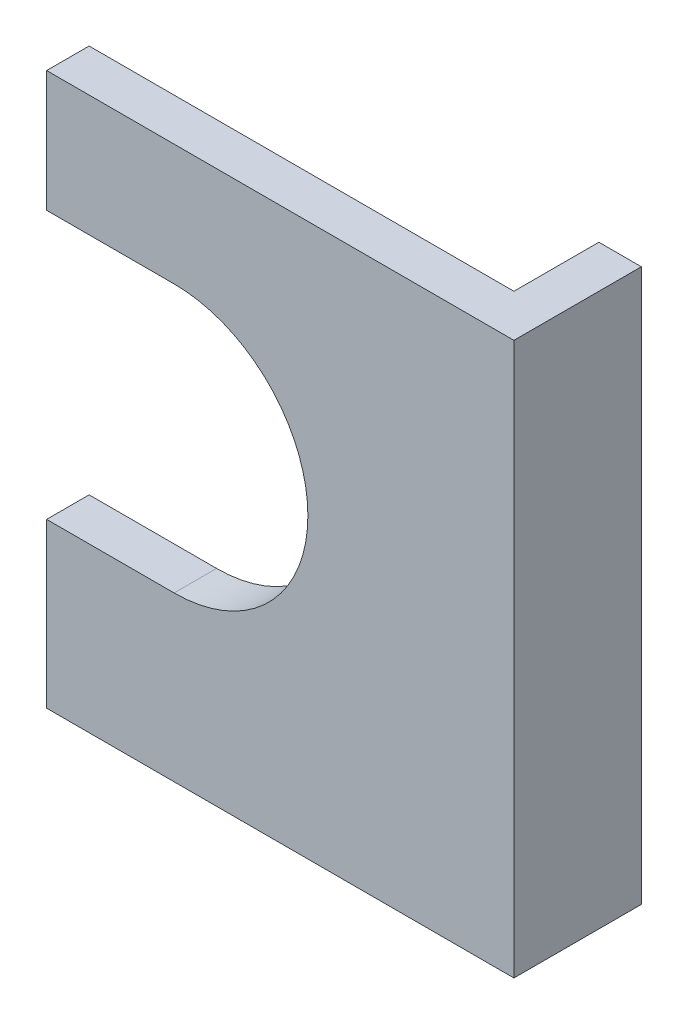
ISO-10303-21;
HEADER;
FILE_DESCRIPTION(('STEP AP214'),'2;1');
FILE_NAME('part.step','',(''),(''),'','','');
FILE_SCHEMA(('AUTOMOTIVE_DESIGN { 1 0 10303 214 1 1 1 1 }'));
ENDSEC;
DATA;
#1=APPLICATION_CONTEXT('core data for automotive mechanical design processes');
#2=APPLICATION_PROTOCOL_DEFINITION('international standard','automotive_design',2000,#1);
#3=PRODUCT_CONTEXT('',#1,'mechanical');
#4=PRODUCT('Part','Part','',(#3));
#5=PRODUCT_RELATED_PRODUCT_CATEGORY('part','',(#4));
#6=PRODUCT_DEFINITION_FORMATION('','',#4);
#7=PRODUCT_DEFINITION_CONTEXT('part definition',#1,'design');
#8=PRODUCT_DEFINITION('design','',#6,#7);
#9=PRODUCT_DEFINITION_SHAPE('','',#8);
#10=(LENGTH_UNIT() NAMED_UNIT(*) SI_UNIT(.MILLI.,.METRE.));
#11=(NAMED_UNIT(*) PLANE_ANGLE_UNIT() SI_UNIT($,.RADIAN.));
#12=(NAMED_UNIT(*) SI_UNIT($,.STERADIAN.) SOLID_ANGLE_UNIT());
#13=UNCERTAINTY_MEASURE_WITH_UNIT(LENGTH_MEASURE(1.E-05),#10,'distance_accuracy_value','');
#14=(GEOMETRIC_REPRESENTATION_CONTEXT(3) GLOBAL_UNCERTAINTY_ASSIGNED_CONTEXT((#13)) GLOBAL_UNIT_ASSIGNED_CONTEXT((#10,
#11,#12)) REPRESENTATION_CONTEXT('',''));
#15=CARTESIAN_POINT('',(0.,0.,0.));
#16=DIRECTION('',(0.,0.,1.));
#17=DIRECTION('',(1.,0.,0.));
#18=AXIS2_PLACEMENT_3D('',#15,#16,#17);
#19=CARTESIAN_POINT('',(60.,90.,-10.));
#20=DIRECTION('',(0.,0.,1.));
#21=DIRECTION('',(0.,-1.,0.));
#22=AXIS2_PLACEMENT_3D('',#19,#20,#21);
#23=PLANE('',#22);
#24=DIRECTION('',(0.,-1.,0.));
#25=VECTOR('',#24,1.);
#26=CARTESIAN_POINT('',(-5.,120.,-10.));
#27=LINE('',#26,#25);
#28=CARTESIAN_POINT('',(-5.,120.,-10.));
#29=VERTEX_POINT('',#28);
#30=CARTESIAN_POINT('',(-5.,91.5,-10.));
#31=VERTEX_POINT('',#30);
#32=EDGE_CURVE('E52',#29,#31,#27,.T.);
#33=ORIENTED_EDGE('',*,*,#32,.F.);
#34=DIRECTION('',(-1.,0.,0.));
#35=VECTOR('',#34,1.);
#36=CARTESIAN_POINT('',(95.,120.,-10.));
#37=LINE('',#36,#35);
#38=CARTESIAN_POINT('',(95.,120.,-10.));
#39=VERTEX_POINT('',#38);
#40=EDGE_CURVE('E182',#39,#29,#37,.T.);
#41=ORIENTED_EDGE('',*,*,#40,.F.);
#42=DIRECTION('',(0.,-1.,0.));
#43=VECTOR('',#42,1.);
#44=CARTESIAN_POINT('',(95.,90.,-10.));
#45=LINE('',#44,#43);
#46=CARTESIAN_POINT('',(95.,0.,-10.));
#47=VERTEX_POINT('',#46);
#48=EDGE_CURVE('E194',#39,#47,#45,.T.);
#49=ORIENTED_EDGE('',*,*,#48,.T.);
#50=DIRECTION('',(-1.,0.,0.));
#51=VECTOR('',#50,1.);
#52=CARTESIAN_POINT('',(60.,0.,-10.));
#53=LINE('',#52,#51);
#54=CARTESIAN_POINT('',(-5.,0.,-10.));
#55=VERTEX_POINT('',#54);
#56=EDGE_CURVE('E202',#47,#55,#53,.T.);
#57=ORIENTED_EDGE('',*,*,#56,.T.);
#58=DIRECTION('',(0.,-1.,0.));
#59=VECTOR('',#58,1.);
#60=CARTESIAN_POINT('',(-5.,28.5,-10.));
#61=LINE('',#60,#59);
#62=CARTESIAN_POINT('',(-5.,28.5,-10.));
#63=VERTEX_POINT('',#62);
#64=EDGE_CURVE('E162',#63,#55,#61,.T.);
#65=ORIENTED_EDGE('',*,*,#64,.F.);
#66=DIRECTION('',(-1.,0.,0.));
#67=VECTOR('',#66,1.);
#68=CARTESIAN_POINT('',(25.,28.5,-10.));
#69=LINE('',#68,#67);
#70=CARTESIAN_POINT('',(25.,28.5,-10.));
#71=VERTEX_POINT('',#70);
#72=EDGE_CURVE('E167',#71,#63,#69,.T.);
#73=ORIENTED_EDGE('',*,*,#72,.F.);
#74=CARTESIAN_POINT('',(25.,60.,-10.));
#75=DIRECTION('',(0.,0.,-1.));
#76=DIRECTION('',(0.,1.,0.));
#77=AXIS2_PLACEMENT_3D('',#74,#75,#76);
#78=CIRCLE('',#77,31.5);
#79=CARTESIAN_POINT('',(25.,91.5,-10.));
#80=VERTEX_POINT('',#79);
#81=EDGE_CURVE('E126',#80,#71,#78,.T.);
#82=ORIENTED_EDGE('',*,*,#81,.F.);
#83=DIRECTION('',(1.,0.,0.));
#84=VECTOR('',#83,1.);
#85=CARTESIAN_POINT('',(25.,91.5,-10.));
#86=LINE('',#85,#84);
#87=EDGE_CURVE('E170',#31,#80,#86,.T.);
#88=ORIENTED_EDGE('',*,*,#87,.F.);
#89=EDGE_LOOP('',(#33,#41,#49,#57,#65,#73,#82,#88));
#90=FACE_BOUND('',#89,.T.);
#91=ADVANCED_FACE('F37',(#90),#23,.F.);
#92=CARTESIAN_POINT('',(60.,-10.,0.));
#93=DIRECTION('',(0.,0.,-1.));
#94=DIRECTION('',(-1.,0.,0.));
#95=AXIS2_PLACEMENT_3D('',#92,#93,#94);
#96=PLANE('',#95);
#97=DIRECTION('',(0.,1.,0.));
#98=VECTOR('',#97,1.);
#99=CARTESIAN_POINT('',(-5.,91.5,0.));
#100=LINE('',#99,#98);
#101=CARTESIAN_POINT('',(-5.,91.5,0.));
#102=VERTEX_POINT('',#101);
#103=CARTESIAN_POINT('',(-5.,120.,0.));
#104=VERTEX_POINT('',#103);
#105=EDGE_CURVE('E155',#102,#104,#100,.T.);
#106=ORIENTED_EDGE('',*,*,#105,.F.);
#107=DIRECTION('',(1.,0.,0.));
#108=VECTOR('',#107,1.);
#109=CARTESIAN_POINT('',(60.,91.5,0.));
#110=LINE('',#109,#108);
#111=CARTESIAN_POINT('',(25.,91.5,0.));
#112=VERTEX_POINT('',#111);
#113=EDGE_CURVE('E180',#102,#112,#110,.T.);
#114=ORIENTED_EDGE('',*,*,#113,.T.);
#115=CARTESIAN_POINT('',(25.,60.,0.));
#116=DIRECTION('',(0.,0.,-1.));
#117=DIRECTION('',(-1.,0.,0.));
#118=AXIS2_PLACEMENT_3D('',#115,#116,#117);
#119=CIRCLE('',#118,31.5);
#120=CARTESIAN_POINT('',(25.,28.5,0.));
#121=VERTEX_POINT('',#120);
#122=EDGE_CURVE('E11',#112,#121,#119,.T.);
#123=ORIENTED_EDGE('',*,*,#122,.T.);
#124=DIRECTION('',(-1.,0.,0.));
#125=VECTOR('',#124,1.);
#126=CARTESIAN_POINT('',(60.,28.5,0.));
#127=LINE('',#126,#125);
#128=CARTESIAN_POINT('',(-5.,28.5,0.));
#129=VERTEX_POINT('',#128);
#130=EDGE_CURVE('E176',#121,#129,#127,.T.);
#131=ORIENTED_EDGE('',*,*,#130,.T.);
#132=DIRECTION('',(0.,1.,0.));
#133=VECTOR('',#132,1.);
#134=CARTESIAN_POINT('',(-5.,-10.,0.));
#135=LINE('',#134,#133);
#136=CARTESIAN_POINT('',(-5.,-10.,0.));
#137=VERTEX_POINT('',#136);
#138=EDGE_CURVE('E60',#137,#129,#135,.T.);
#139=ORIENTED_EDGE('',*,*,#138,.F.);
#140=DIRECTION('',(-1.,0.,0.));
#141=VECTOR('',#140,1.);
#142=CARTESIAN_POINT('',(60.,-10.,0.));
#143=LINE('',#142,#141);
#144=CARTESIAN_POINT('',(105.,-10.,0.));
#145=VERTEX_POINT('',#144);
#146=EDGE_CURVE('E45',#145,#137,#143,.T.);
#147=ORIENTED_EDGE('',*,*,#146,.F.);
#148=DIRECTION('',(0.,-1.,0.));
#149=VECTOR('',#148,1.);
#150=CARTESIAN_POINT('',(105.,0.,0.));
#151=LINE('',#150,#149);
#152=CARTESIAN_POINT('',(105.,120.,0.));
#153=VERTEX_POINT('',#152);
#154=EDGE_CURVE('E199',#153,#145,#151,.T.);
#155=ORIENTED_EDGE('',*,*,#154,.F.);
#156=DIRECTION('',(1.,0.,0.));
#157=VECTOR('',#156,1.);
#158=CARTESIAN_POINT('',(-30.,120.,0.));
#159=LINE('',#158,#157);
#160=EDGE_CURVE('E185',#104,#153,#159,.T.);
#161=ORIENTED_EDGE('',*,*,#160,.F.);
#162=EDGE_LOOP('',(#106,#114,#123,#131,#139,#147,#155,#161));
#163=FACE_BOUND('',#162,.T.);
#164=ADVANCED_FACE('F39',(#163),#96,.F.);
#165=CARTESIAN_POINT('',(0.,120.,0.));
#166=DIRECTION('',(0.,1.,0.));
#167=DIRECTION('',(0.,0.,1.));
#168=AXIS2_PLACEMENT_3D('',#165,#166,#167);
#169=PLANE('',#168);
#170=ORIENTED_EDGE('',*,*,#40,.T.);
#171=DIRECTION('',(0.,0.,-1.));
#172=VECTOR('',#171,1.);
#173=CARTESIAN_POINT('',(-5.,120.,0.));
#174=LINE('',#173,#172);
#175=EDGE_CURVE('E157',#104,#29,#174,.T.);
#176=ORIENTED_EDGE('',*,*,#175,.F.);
#177=ORIENTED_EDGE('',*,*,#160,.T.);
#178=DIRECTION('',(0.,0.,-1.));
#179=VECTOR('',#178,1.);
#180=CARTESIAN_POINT('',(105.,120.,0.));
#181=LINE('',#180,#179);
#182=CARTESIAN_POINT('',(105.,120.,-29.9999999999999));
#183=VERTEX_POINT('',#182);
#184=EDGE_CURVE('E187',#153,#183,#181,.T.);
#185=ORIENTED_EDGE('',*,*,#184,.T.);
#186=DIRECTION('',(1.,0.,0.));
#187=VECTOR('',#186,1.);
#188=CARTESIAN_POINT('',(95.,120.,-29.9999999999999));
#189=LINE('',#188,#187);
#190=CARTESIAN_POINT('',(95.,120.,-29.9999999999999));
#191=VERTEX_POINT('',#190);
#192=EDGE_CURVE('E149',#191,#183,#189,.T.);
#193=ORIENTED_EDGE('',*,*,#192,.F.);
#194=DIRECTION('',(0.,0.,1.));
#195=VECTOR('',#194,1.);
#196=CARTESIAN_POINT('',(95.,120.,-25.));
#197=LINE('',#196,#195);
#198=EDGE_CURVE('E189',#191,#39,#197,.T.);
#199=ORIENTED_EDGE('',*,*,#198,.T.);
#200=EDGE_LOOP('',(#170,#176,#177,#185,#193,#199));
#201=FACE_BOUND('',#200,.T.);
#202=ADVANCED_FACE('F216',(#201),#169,.T.);
#203=CARTESIAN_POINT('',(25.,91.5,20.));
#204=DIRECTION('',(0.,1.,0.));
#205=DIRECTION('',(0.,0.,1.));
#206=AXIS2_PLACEMENT_3D('',#203,#204,#205);
#207=PLANE('',#206);
#208=DIRECTION('',(0.,0.,1.));
#209=VECTOR('',#208,1.);
#210=CARTESIAN_POINT('',(-5.,91.5,-10.));
#211=LINE('',#210,#209);
#212=EDGE_CURVE('E153',#31,#102,#211,.T.);
#213=ORIENTED_EDGE('',*,*,#212,.F.);
#214=ORIENTED_EDGE('',*,*,#87,.T.);
#215=DIRECTION('',(0.,0.,-1.));
#216=VECTOR('',#215,1.);
#217=CARTESIAN_POINT('',(25.,91.5,20.));
#218=LINE('',#217,#216);
#219=EDGE_CURVE('E173',#112,#80,#218,.T.);
#220=ORIENTED_EDGE('',*,*,#219,.F.);
#221=ORIENTED_EDGE('',*,*,#113,.F.);
#222=EDGE_LOOP('',(#213,#214,#220,#221));
#223=FACE_BOUND('',#222,.T.);
#224=ADVANCED_FACE('F222',(#223),#207,.F.);
#225=CARTESIAN_POINT('',(60.,0.,-10.));
#226=DIRECTION('',(0.,-1.,0.));
#227=DIRECTION('',(0.,0.,-1.));
#228=AXIS2_PLACEMENT_3D('',#225,#226,#227);
#229=PLANE('',#228);
#230=DIRECTION('',(0.,0.,-1.));
#231=VECTOR('',#230,1.);
#232=CARTESIAN_POINT('',(-5.,0.,-10.));
#233=LINE('',#232,#231);
#234=CARTESIAN_POINT('',(-5.,0.,-30.));
#235=VERTEX_POINT('',#234);
#236=EDGE_CURVE('E127',#55,#235,#233,.T.);
#237=ORIENTED_EDGE('',*,*,#236,.F.);
#238=ORIENTED_EDGE('',*,*,#56,.F.);
#239=DIRECTION('',(0.,0.,1.));
#240=VECTOR('',#239,1.);
#241=CARTESIAN_POINT('',(95.,0.,-25.));
#242=LINE('',#241,#240);
#243=CARTESIAN_POINT('',(95.,0.,-30.));
#244=VERTEX_POINT('',#243);
#245=EDGE_CURVE('E192',#244,#47,#242,.T.);
#246=ORIENTED_EDGE('',*,*,#245,.F.);
#247=DIRECTION('',(1.,0.,0.));
#248=VECTOR('',#247,1.);
#249=CARTESIAN_POINT('',(-5.,0.,-30.));
#250=LINE('',#249,#248);
#251=EDGE_CURVE('E136',#235,#244,#250,.T.);
#252=ORIENTED_EDGE('',*,*,#251,.F.);
#253=EDGE_LOOP('',(#237,#238,#246,#252));
#254=FACE_BOUND('',#253,.T.);
#255=ADVANCED_FACE('F210',(#254),#229,.F.);
#256=CARTESIAN_POINT('',(60.,-10.,-25.));
#257=DIRECTION('',(0.,1.,0.));
#258=DIRECTION('',(0.,0.,1.));
#259=AXIS2_PLACEMENT_3D('',#256,#257,#258);
#260=PLANE('',#259);
#261=DIRECTION('',(0.,0.,1.));
#262=VECTOR('',#261,1.);
#263=CARTESIAN_POINT('',(-5.,-10.,-25.));
#264=LINE('',#263,#262);
#265=CARTESIAN_POINT('',(-5.,-10.,-30.));
#266=VERTEX_POINT('',#265);
#267=EDGE_CURVE('E120',#266,#137,#264,.T.);
#268=ORIENTED_EDGE('',*,*,#267,.F.);
#269=DIRECTION('',(-1.,0.,0.));
#270=VECTOR('',#269,1.);
#271=CARTESIAN_POINT('',(105.,-10.,-30.));
#272=LINE('',#271,#270);
#273=CARTESIAN_POINT('',(105.,-10.,-30.));
#274=VERTEX_POINT('',#273);
#275=EDGE_CURVE('E125',#274,#266,#272,.T.);
#276=ORIENTED_EDGE('',*,*,#275,.F.);
#277=DIRECTION('',(0.,0.,-1.));
#278=VECTOR('',#277,1.);
#279=CARTESIAN_POINT('',(105.,-10.,0.));
#280=LINE('',#279,#278);
#281=EDGE_CURVE('E197',#145,#274,#280,.T.);
#282=ORIENTED_EDGE('',*,*,#281,.F.);
#283=ORIENTED_EDGE('',*,*,#146,.T.);
#284=EDGE_LOOP('',(#268,#276,#282,#283));
#285=FACE_BOUND('',#284,.T.);
#286=ADVANCED_FACE('F122',(#285),#260,.F.);
#287=CARTESIAN_POINT('',(25.,28.5,20.));
#288=DIRECTION('',(0.,-1.,0.));
#289=DIRECTION('',(0.,0.,-1.));
#290=AXIS2_PLACEMENT_3D('',#287,#288,#289);
#291=PLANE('',#290);
#292=DIRECTION('',(0.,0.,-1.));
#293=VECTOR('',#292,1.);
#294=CARTESIAN_POINT('',(-5.,28.5,0.));
#295=LINE('',#294,#293);
#296=EDGE_CURVE('E160',#129,#63,#295,.T.);
#297=ORIENTED_EDGE('',*,*,#296,.F.);
#298=ORIENTED_EDGE('',*,*,#130,.F.);
#299=DIRECTION('',(0.,0.,-1.));
#300=VECTOR('',#299,1.);
#301=CARTESIAN_POINT('',(25.,28.5,20.));
#302=LINE('',#301,#300);
#303=EDGE_CURVE('E172',#121,#71,#302,.T.);
#304=ORIENTED_EDGE('',*,*,#303,.T.);
#305=ORIENTED_EDGE('',*,*,#72,.T.);
#306=EDGE_LOOP('',(#297,#298,#304,#305));
#307=FACE_BOUND('',#306,.T.);
#308=ADVANCED_FACE('F237',(#307),#291,.F.);
#309=CARTESIAN_POINT('',(105.,0.,0.));
#310=DIRECTION('',(-1.,0.,0.));
#311=DIRECTION('',(0.,0.,1.));
#312=AXIS2_PLACEMENT_3D('',#309,#310,#311);
#313=PLANE('',#312);
#314=ORIENTED_EDGE('',*,*,#281,.T.);
#315=DIRECTION('',(0.,-1.,0.));
#316=VECTOR('',#315,1.);
#317=CARTESIAN_POINT('',(105.,120.,-29.9999999999999));
#318=LINE('',#317,#316);
#319=EDGE_CURVE('E142',#183,#274,#318,.T.);
#320=ORIENTED_EDGE('',*,*,#319,.F.);
#321=ORIENTED_EDGE('',*,*,#184,.F.);
#322=ORIENTED_EDGE('',*,*,#154,.T.);
#323=EDGE_LOOP('',(#314,#320,#321,#322));
#324=FACE_BOUND('',#323,.T.);
#325=ADVANCED_FACE('F235',(#324),#313,.F.);
#326=CARTESIAN_POINT('',(95.,90.,-25.));
#327=DIRECTION('',(1.,0.,0.));
#328=DIRECTION('',(0.,0.,-1.));
#329=AXIS2_PLACEMENT_3D('',#326,#327,#328);
#330=PLANE('',#329);
#331=ORIENTED_EDGE('',*,*,#245,.T.);
#332=ORIENTED_EDGE('',*,*,#48,.F.);
#333=ORIENTED_EDGE('',*,*,#198,.F.);
#334=DIRECTION('',(0.,1.,0.));
#335=VECTOR('',#334,1.);
#336=CARTESIAN_POINT('',(95.,0.,-30.));
#337=LINE('',#336,#335);
#338=EDGE_CURVE('E146',#244,#191,#337,.T.);
#339=ORIENTED_EDGE('',*,*,#338,.F.);
#340=EDGE_LOOP('',(#331,#332,#333,#339));
#341=FACE_BOUND('',#340,.T.);
#342=ADVANCED_FACE('F214',(#341),#330,.F.);
#343=CARTESIAN_POINT('',(25.,60.,20.));
#344=DIRECTION('',(0.,0.,-1.));
#345=DIRECTION('',(0.,1.,0.));
#346=AXIS2_PLACEMENT_3D('',#343,#344,#345);
#347=CYLINDRICAL_SURFACE('',#346,31.5);
#348=ORIENTED_EDGE('',*,*,#219,.T.);
#349=ORIENTED_EDGE('',*,*,#81,.T.);
#350=ORIENTED_EDGE('',*,*,#303,.F.);
#351=ORIENTED_EDGE('',*,*,#122,.F.);
#352=EDGE_LOOP('',(#348,#349,#350,#351));
#353=FACE_BOUND('',#352,.T.);
#354=ADVANCED_FACE('F226',(#353),#347,.F.);
#355=CARTESIAN_POINT('',(-5.,0.,0.));
#356=DIRECTION('',(-1.,0.,0.));
#357=DIRECTION('',(0.,0.,1.));
#358=AXIS2_PLACEMENT_3D('',#355,#356,#357);
#359=PLANE('',#358);
#360=ORIENTED_EDGE('',*,*,#138,.T.);
#361=ORIENTED_EDGE('',*,*,#296,.T.);
#362=ORIENTED_EDGE('',*,*,#64,.T.);
#363=ORIENTED_EDGE('',*,*,#236,.T.);
#364=DIRECTION('',(0.,1.,0.));
#365=VECTOR('',#364,1.);
#366=CARTESIAN_POINT('',(-5.,-10.,-30.));
#367=LINE('',#366,#365);
#368=EDGE_CURVE('E130',#266,#235,#367,.T.);
#369=ORIENTED_EDGE('',*,*,#368,.F.);
#370=ORIENTED_EDGE('',*,*,#267,.T.);
#371=EDGE_LOOP('',(#360,#361,#362,#363,#369,#370));
#372=FACE_BOUND('',#371,.T.);
#373=ADVANCED_FACE('F131',(#372),#359,.T.);
#374=CARTESIAN_POINT('',(-5.,0.,0.));
#375=DIRECTION('',(-1.,0.,0.));
#376=DIRECTION('',(0.,0.,1.));
#377=AXIS2_PLACEMENT_3D('',#374,#375,#376);
#378=PLANE('',#377);
#379=ORIENTED_EDGE('',*,*,#32,.T.);
#380=ORIENTED_EDGE('',*,*,#212,.T.);
#381=ORIENTED_EDGE('',*,*,#105,.T.);
#382=ORIENTED_EDGE('',*,*,#175,.T.);
#383=EDGE_LOOP('',(#379,#380,#381,#382));
#384=FACE_BOUND('',#383,.T.);
#385=ADVANCED_FACE('F232',(#384),#378,.T.);
#386=CARTESIAN_POINT('',(0.,0.,-30.));
#387=DIRECTION('',(0.,0.,-1.));
#388=DIRECTION('',(0.,1.,0.));
#389=AXIS2_PLACEMENT_3D('',#386,#387,#388);
#390=PLANE('',#389);
#391=ORIENTED_EDGE('',*,*,#275,.T.);
#392=ORIENTED_EDGE('',*,*,#368,.T.);
#393=ORIENTED_EDGE('',*,*,#251,.T.);
#394=ORIENTED_EDGE('',*,*,#338,.T.);
#395=ORIENTED_EDGE('',*,*,#192,.T.);
#396=ORIENTED_EDGE('',*,*,#319,.T.);
#397=EDGE_LOOP('',(#391,#392,#393,#394,#395,#396));
#398=FACE_BOUND('',#397,.T.);
#399=ADVANCED_FACE('F139',(#398),#390,.T.);
#400=CLOSED_SHELL('',(#91,#164,#202,#224,#255,#286,#308,#325,#342,#354,#373,#385,#399));
#401=MANIFOLD_SOLID_BREP('B2',#400);
#402=ADVANCED_BREP_SHAPE_REPRESENTATION('',(#18,#401),#14);
#403=SHAPE_DEFINITION_REPRESENTATION(#9,#402);
ENDSEC;
END-ISO-10303-21;
